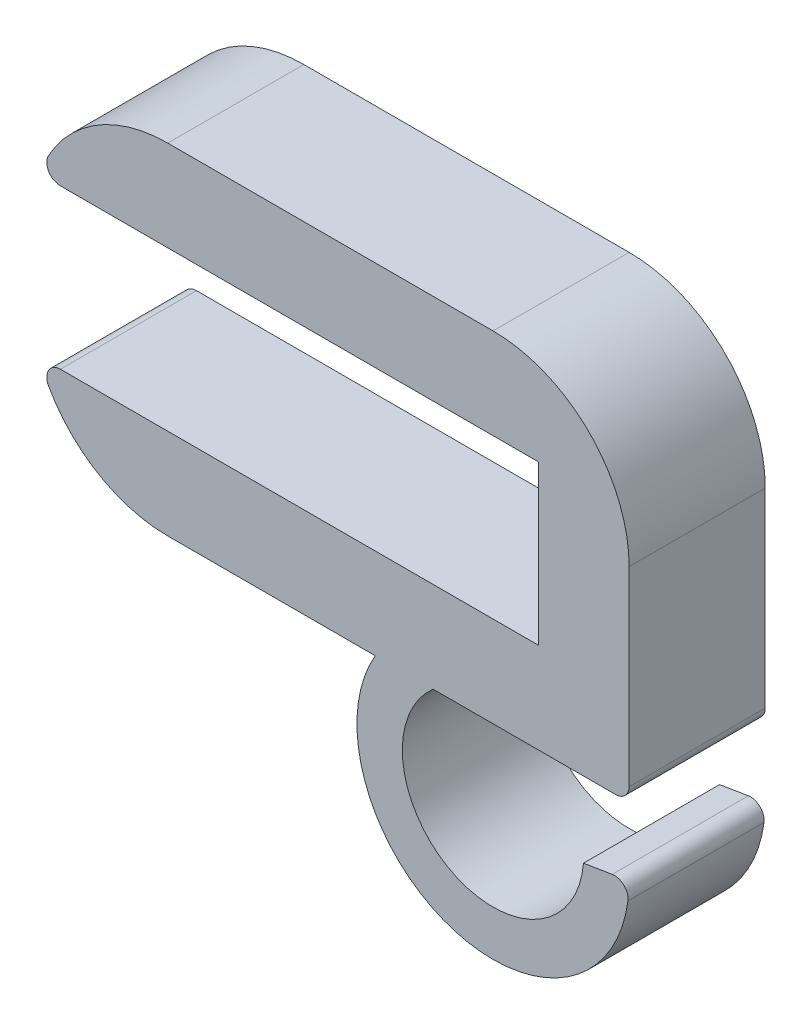
ISO-10303-21;
HEADER;
FILE_DESCRIPTION(('STEP AP214'),'2;1');
FILE_NAME('part.step','',(''),(''),'','','');
FILE_SCHEMA(('AUTOMOTIVE_DESIGN { 1 0 10303 214 1 1 1 1 }'));
ENDSEC;
DATA;
#1=APPLICATION_CONTEXT('core data for automotive mechanical design processes');
#2=APPLICATION_PROTOCOL_DEFINITION('international standard','automotive_design',2000,#1);
#3=PRODUCT_CONTEXT('',#1,'mechanical');
#4=PRODUCT('Part','Part','',(#3));
#5=PRODUCT_RELATED_PRODUCT_CATEGORY('part','',(#4));
#6=PRODUCT_DEFINITION_FORMATION('','',#4);
#7=PRODUCT_DEFINITION_CONTEXT('part definition',#1,'design');
#8=PRODUCT_DEFINITION('design','',#6,#7);
#9=PRODUCT_DEFINITION_SHAPE('','',#8);
#10=(LENGTH_UNIT() NAMED_UNIT(*) SI_UNIT(.MILLI.,.METRE.));
#11=(NAMED_UNIT(*) PLANE_ANGLE_UNIT() SI_UNIT($,.RADIAN.));
#12=(NAMED_UNIT(*) SI_UNIT($,.STERADIAN.) SOLID_ANGLE_UNIT());
#13=UNCERTAINTY_MEASURE_WITH_UNIT(LENGTH_MEASURE(1.E-05),#10,'distance_accuracy_value','');
#14=(GEOMETRIC_REPRESENTATION_CONTEXT(3) GLOBAL_UNCERTAINTY_ASSIGNED_CONTEXT((#13)) GLOBAL_UNIT_ASSIGNED_CONTEXT((#10,
#11,#12)) REPRESENTATION_CONTEXT('',''));
#15=CARTESIAN_POINT('',(0.,0.,0.));
#16=DIRECTION('',(0.,0.,1.));
#17=DIRECTION('',(1.,0.,0.));
#18=AXIS2_PLACEMENT_3D('',#15,#16,#17);
#19=CARTESIAN_POINT('',(0.,0.,3.));
#20=DIRECTION('',(0.,1.,0.));
#21=DIRECTION('',(0.,0.,1.));
#22=AXIS2_PLACEMENT_3D('',#19,#20,#21);
#23=PLANE('',#22);
#24=DIRECTION('',(1.,0.,0.));
#25=VECTOR('',#24,1.);
#26=CARTESIAN_POINT('',(0.,0.,0.));
#27=LINE('',#26,#25);
#28=CARTESIAN_POINT('',(2.82842712474619,0.,0.));
#29=VERTEX_POINT('',#28);
#30=CARTESIAN_POINT('',(7.40192378864668,0.,0.));
#31=VERTEX_POINT('',#30);
#32=EDGE_CURVE('E214',#29,#31,#27,.T.);
#33=ORIENTED_EDGE('',*,*,#32,.T.);
#34=DIRECTION('',(0.,0.,1.));
#35=VECTOR('',#34,1.);
#36=CARTESIAN_POINT('',(7.40192378864668,0.,0.));
#37=LINE('',#36,#35);
#38=CARTESIAN_POINT('',(7.40192378864668,0.,3.));
#39=VERTEX_POINT('',#38);
#40=EDGE_CURVE('E188',#31,#39,#37,.T.);
#41=ORIENTED_EDGE('',*,*,#40,.T.);
#42=DIRECTION('',(1.,0.,0.));
#43=VECTOR('',#42,1.);
#44=CARTESIAN_POINT('',(0.,0.,3.));
#45=LINE('',#44,#43);
#46=CARTESIAN_POINT('',(2.82842712474619,0.,3.));
#47=VERTEX_POINT('',#46);
#48=EDGE_CURVE('E217',#47,#39,#45,.T.);
#49=ORIENTED_EDGE('',*,*,#48,.F.);
#50=DIRECTION('',(0.,0.,1.));
#51=VECTOR('',#50,1.);
#52=CARTESIAN_POINT('',(2.82842712474619,0.,3.));
#53=LINE('',#52,#51);
#54=EDGE_CURVE('E164',#47,#29,#53,.F.);
#55=ORIENTED_EDGE('',*,*,#54,.T.);
#56=EDGE_LOOP('',(#33,#41,#49,#55));
#57=FACE_BOUND('',#56,.T.);
#58=ADVANCED_FACE('F33',(#57),#23,.F.);
#59=CARTESIAN_POINT('',(8.67712434446771,0.,0.));
#60=VERTEX_POINT('',#59);
#61=CARTESIAN_POINT('',(12.7,0.,0.));
#62=VERTEX_POINT('',#61);
#63=EDGE_CURVE('E225',#60,#62,#27,.T.);
#64=ORIENTED_EDGE('',*,*,#63,.T.);
#65=DIRECTION('',(0.,0.,-1.));
#66=VECTOR('',#65,1.);
#67=CARTESIAN_POINT('',(12.7,0.,3.));
#68=LINE('',#67,#66);
#69=CARTESIAN_POINT('',(12.7,0.,3.));
#70=VERTEX_POINT('',#69);
#71=EDGE_CURVE('E272',#62,#70,#68,.F.);
#72=ORIENTED_EDGE('',*,*,#71,.T.);
#73=CARTESIAN_POINT('',(8.67712434446771,0.,3.));
#74=VERTEX_POINT('',#73);
#75=EDGE_CURVE('E216',#74,#70,#45,.T.);
#76=ORIENTED_EDGE('',*,*,#75,.F.);
#77=DIRECTION('',(0.,0.,1.));
#78=VECTOR('',#77,1.);
#79=CARTESIAN_POINT('',(8.67712434446771,0.,0.));
#80=LINE('',#79,#78);
#81=EDGE_CURVE('E176',#60,#74,#80,.T.);
#82=ORIENTED_EDGE('',*,*,#81,.F.);
#83=EDGE_LOOP('',(#64,#72,#76,#82));
#84=FACE_BOUND('',#83,.T.);
#85=ADVANCED_FACE('F308',(#84),#23,.F.);
#86=CARTESIAN_POINT('',(13.,0.,3.));
#87=DIRECTION('',(-1.,0.,0.));
#88=DIRECTION('',(0.,0.,1.));
#89=AXIS2_PLACEMENT_3D('',#86,#87,#88);
#90=PLANE('',#89);
#91=DIRECTION('',(0.,1.,0.));
#92=VECTOR('',#91,1.);
#93=CARTESIAN_POINT('',(13.,0.,3.));
#94=LINE('',#93,#92);
#95=CARTESIAN_POINT('',(13.,0.3,3.));
#96=VERTEX_POINT('',#95);
#97=CARTESIAN_POINT('',(13.,4.5,3.));
#98=VERTEX_POINT('',#97);
#99=EDGE_CURVE('E213',#96,#98,#94,.T.);
#100=ORIENTED_EDGE('',*,*,#99,.F.);
#101=DIRECTION('',(0.,0.,-1.));
#102=VECTOR('',#101,1.);
#103=CARTESIAN_POINT('',(13.,0.3,3.));
#104=LINE('',#103,#102);
#105=CARTESIAN_POINT('',(13.,0.3,0.));
#106=VERTEX_POINT('',#105);
#107=EDGE_CURVE('E269',#96,#106,#104,.T.);
#108=ORIENTED_EDGE('',*,*,#107,.T.);
#109=DIRECTION('',(0.,1.,0.));
#110=VECTOR('',#109,1.);
#111=CARTESIAN_POINT('',(13.,0.,0.));
#112=LINE('',#111,#110);
#113=CARTESIAN_POINT('',(13.,4.5,0.));
#114=VERTEX_POINT('',#113);
#115=EDGE_CURVE('E223',#106,#114,#112,.T.);
#116=ORIENTED_EDGE('',*,*,#115,.T.);
#117=DIRECTION('',(0.,0.,-1.));
#118=VECTOR('',#117,1.);
#119=CARTESIAN_POINT('',(13.,4.5,3.));
#120=LINE('',#119,#118);
#121=EDGE_CURVE('E239',#114,#98,#120,.F.);
#122=ORIENTED_EDGE('',*,*,#121,.T.);
#123=EDGE_LOOP('',(#100,#108,#116,#122));
#124=FACE_BOUND('',#123,.T.);
#125=ADVANCED_FACE('F301',(#124),#90,.F.);
#126=CARTESIAN_POINT('',(0.,7.5,3.));
#127=DIRECTION('',(0.,1.,0.));
#128=DIRECTION('',(0.,0.,1.));
#129=AXIS2_PLACEMENT_3D('',#126,#127,#128);
#130=PLANE('',#129);
#131=DIRECTION('',(1.,0.,0.));
#132=VECTOR('',#131,1.);
#133=CARTESIAN_POINT('',(0.,7.5,3.));
#134=LINE('',#133,#132);
#135=CARTESIAN_POINT('',(2.82842712474619,7.5,3.));
#136=VERTEX_POINT('',#135);
#137=CARTESIAN_POINT('',(9.99999999999999,7.5,3.));
#138=VERTEX_POINT('',#137);
#139=EDGE_CURVE('E210',#136,#138,#134,.T.);
#140=ORIENTED_EDGE('',*,*,#139,.T.);
#141=DIRECTION('',(0.,0.,-1.));
#142=VECTOR('',#141,1.);
#143=CARTESIAN_POINT('',(10.,7.5,0.));
#144=LINE('',#143,#142);
#145=CARTESIAN_POINT('',(9.99999999999999,7.5,0.));
#146=VERTEX_POINT('',#145);
#147=EDGE_CURVE('E228',#138,#146,#144,.T.);
#148=ORIENTED_EDGE('',*,*,#147,.T.);
#149=DIRECTION('',(1.,0.,0.));
#150=VECTOR('',#149,1.);
#151=CARTESIAN_POINT('',(0.,7.5,0.));
#152=LINE('',#151,#150);
#153=CARTESIAN_POINT('',(2.82842712474619,7.5,0.));
#154=VERTEX_POINT('',#153);
#155=EDGE_CURVE('E207',#154,#146,#152,.T.);
#156=ORIENTED_EDGE('',*,*,#155,.F.);
#157=DIRECTION('',(0.,0.,1.));
#158=VECTOR('',#157,1.);
#159=CARTESIAN_POINT('',(2.82842712474619,7.5,3.));
#160=LINE('',#159,#158);
#161=EDGE_CURVE('E220',#154,#136,#160,.T.);
#162=ORIENTED_EDGE('',*,*,#161,.T.);
#163=EDGE_LOOP('',(#140,#148,#156,#162));
#164=FACE_BOUND('',#163,.T.);
#165=ADVANCED_FACE('F290',(#164),#130,.T.);
#166=CARTESIAN_POINT('',(0.,0.,3.));
#167=DIRECTION('',(0.,0.,-1.));
#168=DIRECTION('',(-1.,0.,0.));
#169=AXIS2_PLACEMENT_3D('',#166,#167,#168);
#170=PLANE('',#169);
#171=CARTESIAN_POINT('',(10.,-1.5,3.));
#172=DIRECTION('',(0.,0.,1.));
#173=DIRECTION('',(1.,0.,0.));
#174=AXIS2_PLACEMENT_3D('',#171,#172,#173);
#175=CIRCLE('',#174,3.);
#176=CARTESIAN_POINT('',(12.9736661077925,-1.89662309484698,3.));
#177=VERTEX_POINT('',#176);
#178=EDGE_CURVE('E179',#39,#177,#175,.T.);
#179=ORIENTED_EDGE('',*,*,#178,.T.);
#180=CARTESIAN_POINT('',(12.6762994970133,-1.85696078536228,3.));
#181=DIRECTION('',(0.,0.,-1.));
#182=DIRECTION('',(-1.,0.,0.));
#183=AXIS2_PLACEMENT_3D('',#180,#181,#182);
#184=CIRCLE('',#183,0.3);
#185=CARTESIAN_POINT('',(12.6278516739864,-1.56089861546555,3.));
#186=VERTEX_POINT('',#185);
#187=EDGE_CURVE('E172',#177,#186,#184,.F.);
#188=ORIENTED_EDGE('',*,*,#187,.T.);
#189=DIRECTION('',(0.986873899655769,0.161492743422779,0.));
#190=VECTOR('',#189,1.);
#191=CARTESIAN_POINT('',(10.,-1.99092212332024,3.));
#192=LINE('',#191,#190);
#193=CARTESIAN_POINT('',(11.99320255714,-1.66475304613407,3.));
#194=VERTEX_POINT('',#193);
#195=EDGE_CURVE('E155',#194,#186,#192,.T.);
#196=ORIENTED_EDGE('',*,*,#195,.F.);
#197=CARTESIAN_POINT('',(10.,-1.5,3.));
#198=DIRECTION('',(0.,0.,1.));
#199=DIRECTION('',(1.,0.,0.));
#200=AXIS2_PLACEMENT_3D('',#197,#198,#199);
#201=CIRCLE('',#200,2.);
#202=EDGE_CURVE('E171',#74,#194,#201,.T.);
#203=ORIENTED_EDGE('',*,*,#202,.F.);
#204=ORIENTED_EDGE('',*,*,#75,.T.);
#205=CARTESIAN_POINT('',(12.7,0.3,3.));
#206=DIRECTION('',(0.,0.,-1.));
#207=DIRECTION('',(-1.,0.,0.));
#208=AXIS2_PLACEMENT_3D('',#205,#206,#207);
#209=CIRCLE('',#208,0.3);
#210=EDGE_CURVE('E257',#70,#96,#209,.F.);
#211=ORIENTED_EDGE('',*,*,#210,.T.);
#212=ORIENTED_EDGE('',*,*,#99,.T.);
#213=CARTESIAN_POINT('',(10.,4.5,3.));
#214=DIRECTION('',(0.,0.,-1.));
#215=DIRECTION('',(-1.,0.,0.));
#216=AXIS2_PLACEMENT_3D('',#213,#214,#215);
#217=CIRCLE('',#216,3.);
#218=EDGE_CURVE('E247',#98,#138,#217,.F.);
#219=ORIENTED_EDGE('',*,*,#218,.T.);
#220=ORIENTED_EDGE('',*,*,#139,.F.);
#221=CARTESIAN_POINT('',(2.82842712474619,4.5,3.));
#222=DIRECTION('',(0.,0.,-1.));
#223=DIRECTION('',(-1.,0.,0.));
#224=AXIS2_PLACEMENT_3D('',#221,#222,#223);
#225=CIRCLE('',#224,3.);
#226=CARTESIAN_POINT('',(0.199058332257472,5.94444444444444,3.));
#227=VERTEX_POINT('',#226);
#228=EDGE_CURVE('E242',#136,#227,#225,.F.);
#229=ORIENTED_EDGE('',*,*,#228,.T.);
#230=CARTESIAN_POINT('',(0.461995211506343,5.8,3.));
#231=DIRECTION('',(0.,0.,-1.));
#232=DIRECTION('',(-1.,0.,0.));
#233=AXIS2_PLACEMENT_3D('',#230,#231,#232);
#234=CIRCLE('',#233,0.3);
#235=CARTESIAN_POINT('',(0.461995211506343,5.5,3.));
#236=VERTEX_POINT('',#235);
#237=EDGE_CURVE('E253',#227,#236,#234,.F.);
#238=ORIENTED_EDGE('',*,*,#237,.T.);
#239=DIRECTION('',(-1.,0.,0.));
#240=VECTOR('',#239,1.);
#241=CARTESIAN_POINT('',(0.,5.5,3.));
#242=LINE('',#241,#240);
#243=CARTESIAN_POINT('',(11.,5.5,3.));
#244=VERTEX_POINT('',#243);
#245=EDGE_CURVE('E194',#244,#236,#242,.T.);
#246=ORIENTED_EDGE('',*,*,#245,.F.);
#247=DIRECTION('',(0.,1.,0.));
#248=VECTOR('',#247,1.);
#249=CARTESIAN_POINT('',(11.,5.5,3.));
#250=LINE('',#249,#248);
#251=CARTESIAN_POINT('',(11.,2.,3.));
#252=VERTEX_POINT('',#251);
#253=EDGE_CURVE('E201',#252,#244,#250,.T.);
#254=ORIENTED_EDGE('',*,*,#253,.F.);
#255=DIRECTION('',(1.,0.,0.));
#256=VECTOR('',#255,1.);
#257=CARTESIAN_POINT('',(0.,2.,3.));
#258=LINE('',#257,#256);
#259=CARTESIAN_POINT('',(0.461995211506343,2.,3.));
#260=VERTEX_POINT('',#259);
#261=EDGE_CURVE('E190',#260,#252,#258,.T.);
#262=ORIENTED_EDGE('',*,*,#261,.F.);
#263=CARTESIAN_POINT('',(0.461995211506343,1.7,3.));
#264=DIRECTION('',(0.,0.,-1.));
#265=DIRECTION('',(-1.,0.,0.));
#266=AXIS2_PLACEMENT_3D('',#263,#264,#265);
#267=CIRCLE('',#266,0.3);
#268=CARTESIAN_POINT('',(0.199058332257472,1.55555555555556,3.));
#269=VERTEX_POINT('',#268);
#270=EDGE_CURVE('E255',#260,#269,#267,.F.);
#271=ORIENTED_EDGE('',*,*,#270,.T.);
#272=CARTESIAN_POINT('',(2.82842712474619,3.,3.));
#273=DIRECTION('',(0.,0.,-1.));
#274=DIRECTION('',(-1.,0.,0.));
#275=AXIS2_PLACEMENT_3D('',#272,#273,#274);
#276=CIRCLE('',#275,3.);
#277=EDGE_CURVE('E245',#269,#47,#276,.F.);
#278=ORIENTED_EDGE('',*,*,#277,.T.);
#279=ORIENTED_EDGE('',*,*,#48,.T.);
#280=EDGE_LOOP('',(#179,#188,#196,#203,#204,#211,#212,#219,#220,#229,#238,#246,#254,#262,#271,
#278,#279));
#281=FACE_BOUND('',#280,.T.);
#282=ADVANCED_FACE('F169',(#281),#170,.F.);
#283=CARTESIAN_POINT('',(0.,0.,0.));
#284=DIRECTION('',(0.,0.,-1.));
#285=DIRECTION('',(-1.,0.,0.));
#286=AXIS2_PLACEMENT_3D('',#283,#284,#285);
#287=PLANE('',#286);
#288=DIRECTION('',(0.986873899655769,0.161492743422779,0.));
#289=VECTOR('',#288,1.);
#290=CARTESIAN_POINT('',(10.,-1.99092212332024,0.));
#291=LINE('',#290,#289);
#292=CARTESIAN_POINT('',(11.99320255714,-1.66475304613407,0.));
#293=VERTEX_POINT('',#292);
#294=CARTESIAN_POINT('',(12.6278516739864,-1.56089861546555,0.));
#295=VERTEX_POINT('',#294);
#296=EDGE_CURVE('E158',#293,#295,#291,.T.);
#297=ORIENTED_EDGE('',*,*,#296,.T.);
#298=CARTESIAN_POINT('',(12.6762994970133,-1.85696078536228,0.));
#299=DIRECTION('',(0.,0.,-1.));
#300=DIRECTION('',(-1.,0.,0.));
#301=AXIS2_PLACEMENT_3D('',#298,#299,#300);
#302=CIRCLE('',#301,0.3);
#303=CARTESIAN_POINT('',(12.9736661077925,-1.89662309484698,0.));
#304=VERTEX_POINT('',#303);
#305=EDGE_CURVE('E267',#295,#304,#302,.T.);
#306=ORIENTED_EDGE('',*,*,#305,.T.);
#307=CARTESIAN_POINT('',(10.,-1.5,0.));
#308=DIRECTION('',(0.,0.,1.));
#309=DIRECTION('',(1.,0.,0.));
#310=AXIS2_PLACEMENT_3D('',#307,#308,#309);
#311=CIRCLE('',#310,3.);
#312=EDGE_CURVE('E183',#31,#304,#311,.T.);
#313=ORIENTED_EDGE('',*,*,#312,.F.);
#314=ORIENTED_EDGE('',*,*,#32,.F.);
#315=CARTESIAN_POINT('',(2.82842712474619,3.,0.));
#316=DIRECTION('',(0.,0.,-1.));
#317=DIRECTION('',(-1.,0.,0.));
#318=AXIS2_PLACEMENT_3D('',#315,#316,#317);
#319=CIRCLE('',#318,3.);
#320=CARTESIAN_POINT('',(0.199058332257472,1.55555555555556,0.));
#321=VERTEX_POINT('',#320);
#322=EDGE_CURVE('E233',#29,#321,#319,.T.);
#323=ORIENTED_EDGE('',*,*,#322,.T.);
#324=CARTESIAN_POINT('',(0.461995211506343,1.7,0.));
#325=DIRECTION('',(0.,0.,-1.));
#326=DIRECTION('',(-1.,0.,0.));
#327=AXIS2_PLACEMENT_3D('',#324,#325,#326);
#328=CIRCLE('',#327,0.3);
#329=CARTESIAN_POINT('',(0.461995211506343,2.,0.));
#330=VERTEX_POINT('',#329);
#331=EDGE_CURVE('E263',#321,#330,#328,.T.);
#332=ORIENTED_EDGE('',*,*,#331,.T.);
#333=DIRECTION('',(1.,0.,0.));
#334=VECTOR('',#333,1.);
#335=CARTESIAN_POINT('',(0.,2.,0.));
#336=LINE('',#335,#334);
#337=CARTESIAN_POINT('',(11.,2.,0.));
#338=VERTEX_POINT('',#337);
#339=EDGE_CURVE('E191',#330,#338,#336,.T.);
#340=ORIENTED_EDGE('',*,*,#339,.T.);
#341=DIRECTION('',(0.,1.,0.));
#342=VECTOR('',#341,1.);
#343=CARTESIAN_POINT('',(11.,5.5,0.));
#344=LINE('',#343,#342);
#345=CARTESIAN_POINT('',(11.,5.5,0.));
#346=VERTEX_POINT('',#345);
#347=EDGE_CURVE('E193',#338,#346,#344,.T.);
#348=ORIENTED_EDGE('',*,*,#347,.T.);
#349=DIRECTION('',(-1.,0.,0.));
#350=VECTOR('',#349,1.);
#351=CARTESIAN_POINT('',(0.,5.5,0.));
#352=LINE('',#351,#350);
#353=CARTESIAN_POINT('',(0.461995211506343,5.5,0.));
#354=VERTEX_POINT('',#353);
#355=EDGE_CURVE('E197',#346,#354,#352,.T.);
#356=ORIENTED_EDGE('',*,*,#355,.T.);
#357=CARTESIAN_POINT('',(0.461995211506343,5.8,0.));
#358=DIRECTION('',(0.,0.,-1.));
#359=DIRECTION('',(-1.,0.,0.));
#360=AXIS2_PLACEMENT_3D('',#357,#358,#359);
#361=CIRCLE('',#360,0.3);
#362=CARTESIAN_POINT('',(0.199058332257472,5.94444444444444,0.));
#363=VERTEX_POINT('',#362);
#364=EDGE_CURVE('E48',#354,#363,#361,.T.);
#365=ORIENTED_EDGE('',*,*,#364,.T.);
#366=CARTESIAN_POINT('',(2.82842712474619,4.5,0.));
#367=DIRECTION('',(0.,0.,-1.));
#368=DIRECTION('',(-1.,0.,0.));
#369=AXIS2_PLACEMENT_3D('',#366,#367,#368);
#370=CIRCLE('',#369,3.);
#371=EDGE_CURVE('E231',#363,#154,#370,.T.);
#372=ORIENTED_EDGE('',*,*,#371,.T.);
#373=ORIENTED_EDGE('',*,*,#155,.T.);
#374=CARTESIAN_POINT('',(10.,4.5,0.));
#375=DIRECTION('',(0.,0.,-1.));
#376=DIRECTION('',(-1.,0.,0.));
#377=AXIS2_PLACEMENT_3D('',#374,#375,#376);
#378=CIRCLE('',#377,3.);
#379=EDGE_CURVE('E236',#146,#114,#378,.T.);
#380=ORIENTED_EDGE('',*,*,#379,.T.);
#381=ORIENTED_EDGE('',*,*,#115,.F.);
#382=CARTESIAN_POINT('',(12.7,0.3,0.));
#383=DIRECTION('',(0.,0.,-1.));
#384=DIRECTION('',(-1.,0.,0.));
#385=AXIS2_PLACEMENT_3D('',#382,#383,#384);
#386=CIRCLE('',#385,0.3);
#387=EDGE_CURVE('E265',#106,#62,#386,.T.);
#388=ORIENTED_EDGE('',*,*,#387,.T.);
#389=ORIENTED_EDGE('',*,*,#63,.F.);
#390=CARTESIAN_POINT('',(10.,-1.5,0.));
#391=DIRECTION('',(0.,0.,1.));
#392=DIRECTION('',(1.,0.,0.));
#393=AXIS2_PLACEMENT_3D('',#390,#391,#392);
#394=CIRCLE('',#393,2.);
#395=EDGE_CURVE('E177',#60,#293,#394,.T.);
#396=ORIENTED_EDGE('',*,*,#395,.T.);
#397=EDGE_LOOP('',(#297,#306,#313,#314,#323,#332,#340,#348,#356,#365,#372,#373,#380,#381,#388,
#389,#396));
#398=FACE_BOUND('',#397,.T.);
#399=ADVANCED_FACE('F296',(#398),#287,.T.);
#400=CARTESIAN_POINT('',(0.,5.5,0.));
#401=DIRECTION('',(0.,1.,0.));
#402=DIRECTION('',(0.,0.,1.));
#403=AXIS2_PLACEMENT_3D('',#400,#401,#402);
#404=PLANE('',#403);
#405=ORIENTED_EDGE('',*,*,#245,.T.);
#406=DIRECTION('',(0.,0.,1.));
#407=VECTOR('',#406,1.);
#408=CARTESIAN_POINT('',(0.461995211506343,5.5,0.));
#409=LINE('',#408,#407);
#410=EDGE_CURVE('E11',#236,#354,#409,.F.);
#411=ORIENTED_EDGE('',*,*,#410,.T.);
#412=ORIENTED_EDGE('',*,*,#355,.F.);
#413=DIRECTION('',(0.,0.,1.));
#414=VECTOR('',#413,1.);
#415=CARTESIAN_POINT('',(11.,5.5,0.));
#416=LINE('',#415,#414);
#417=EDGE_CURVE('E205',#346,#244,#416,.T.);
#418=ORIENTED_EDGE('',*,*,#417,.T.);
#419=EDGE_LOOP('',(#405,#411,#412,#418));
#420=FACE_BOUND('',#419,.T.);
#421=ADVANCED_FACE('F425',(#420),#404,.F.);
#422=CARTESIAN_POINT('',(11.,5.5,0.));
#423=DIRECTION('',(1.,0.,0.));
#424=DIRECTION('',(0.,0.,-1.));
#425=AXIS2_PLACEMENT_3D('',#422,#423,#424);
#426=PLANE('',#425);
#427=ORIENTED_EDGE('',*,*,#253,.T.);
#428=ORIENTED_EDGE('',*,*,#417,.F.);
#429=ORIENTED_EDGE('',*,*,#347,.F.);
#430=DIRECTION('',(0.,0.,1.));
#431=VECTOR('',#430,1.);
#432=CARTESIAN_POINT('',(11.,2.,0.));
#433=LINE('',#432,#431);
#434=EDGE_CURVE('E199',#338,#252,#433,.T.);
#435=ORIENTED_EDGE('',*,*,#434,.T.);
#436=EDGE_LOOP('',(#427,#428,#429,#435));
#437=FACE_BOUND('',#436,.T.);
#438=ADVANCED_FACE('F337',(#437),#426,.F.);
#439=CARTESIAN_POINT('',(0.,2.,0.));
#440=DIRECTION('',(0.,-1.,0.));
#441=DIRECTION('',(0.,0.,-1.));
#442=AXIS2_PLACEMENT_3D('',#439,#440,#441);
#443=PLANE('',#442);
#444=ORIENTED_EDGE('',*,*,#339,.F.);
#445=DIRECTION('',(0.,0.,-1.));
#446=VECTOR('',#445,1.);
#447=CARTESIAN_POINT('',(0.461995211506343,2.,3.));
#448=LINE('',#447,#446);
#449=EDGE_CURVE('E274',#330,#260,#448,.F.);
#450=ORIENTED_EDGE('',*,*,#449,.T.);
#451=ORIENTED_EDGE('',*,*,#261,.T.);
#452=ORIENTED_EDGE('',*,*,#434,.F.);
#453=EDGE_LOOP('',(#444,#450,#451,#452));
#454=FACE_BOUND('',#453,.T.);
#455=ADVANCED_FACE('F333',(#454),#443,.F.);
#456=CARTESIAN_POINT('',(10.,4.5,3.));
#457=DIRECTION('',(0.,0.,1.));
#458=DIRECTION('',(1.,0.,0.));
#459=AXIS2_PLACEMENT_3D('',#456,#457,#458);
#460=CYLINDRICAL_SURFACE('',#459,3.);
#461=ORIENTED_EDGE('',*,*,#218,.F.);
#462=ORIENTED_EDGE('',*,*,#121,.F.);
#463=ORIENTED_EDGE('',*,*,#379,.F.);
#464=ORIENTED_EDGE('',*,*,#147,.F.);
#465=EDGE_LOOP('',(#461,#462,#463,#464));
#466=FACE_BOUND('',#465,.T.);
#467=ADVANCED_FACE('F293',(#466),#460,.T.);
#468=CARTESIAN_POINT('',(2.82842712474619,3.,3.));
#469=DIRECTION('',(0.,0.,1.));
#470=DIRECTION('',(1.,0.,0.));
#471=AXIS2_PLACEMENT_3D('',#468,#469,#470);
#472=CYLINDRICAL_SURFACE('',#471,3.);
#473=ORIENTED_EDGE('',*,*,#277,.F.);
#474=DIRECTION('',(0.,0.,1.));
#475=VECTOR('',#474,1.);
#476=CARTESIAN_POINT('',(0.199058332257471,1.55555555555556,3.));
#477=LINE('',#476,#475);
#478=EDGE_CURVE('E277',#269,#321,#477,.F.);
#479=ORIENTED_EDGE('',*,*,#478,.T.);
#480=ORIENTED_EDGE('',*,*,#322,.F.);
#481=ORIENTED_EDGE('',*,*,#54,.F.);
#482=EDGE_LOOP('',(#473,#479,#480,#481));
#483=FACE_BOUND('',#482,.T.);
#484=ADVANCED_FACE('F324',(#483),#472,.T.);
#485=CARTESIAN_POINT('',(2.82842712474619,4.5,3.));
#486=DIRECTION('',(0.,0.,-1.));
#487=DIRECTION('',(-1.,0.,0.));
#488=AXIS2_PLACEMENT_3D('',#485,#486,#487);
#489=CYLINDRICAL_SURFACE('',#488,3.);
#490=ORIENTED_EDGE('',*,*,#371,.F.);
#491=DIRECTION('',(0.,0.,-1.));
#492=VECTOR('',#491,1.);
#493=CARTESIAN_POINT('',(0.199058332257471,5.94444444444444,3.));
#494=LINE('',#493,#492);
#495=EDGE_CURVE('E41',#363,#227,#494,.F.);
#496=ORIENTED_EDGE('',*,*,#495,.T.);
#497=ORIENTED_EDGE('',*,*,#228,.F.);
#498=ORIENTED_EDGE('',*,*,#161,.F.);
#499=EDGE_LOOP('',(#490,#496,#497,#498));
#500=FACE_BOUND('',#499,.T.);
#501=ADVANCED_FACE('F282',(#500),#489,.T.);
#502=CARTESIAN_POINT('',(10.,-1.5,0.));
#503=DIRECTION('',(0.,0.,1.));
#504=DIRECTION('',(1.,0.,0.));
#505=AXIS2_PLACEMENT_3D('',#502,#503,#504);
#506=CYLINDRICAL_SURFACE('',#505,3.);
#507=ORIENTED_EDGE('',*,*,#312,.T.);
#508=DIRECTION('',(0.,0.,1.));
#509=VECTOR('',#508,1.);
#510=CARTESIAN_POINT('',(12.9736661077925,-1.89662309484698,0.));
#511=LINE('',#510,#509);
#512=EDGE_CURVE('E163',#304,#177,#511,.T.);
#513=ORIENTED_EDGE('',*,*,#512,.T.);
#514=ORIENTED_EDGE('',*,*,#178,.F.);
#515=ORIENTED_EDGE('',*,*,#40,.F.);
#516=EDGE_LOOP('',(#507,#513,#514,#515));
#517=FACE_BOUND('',#516,.T.);
#518=ADVANCED_FACE('F316',(#517),#506,.T.);
#519=CARTESIAN_POINT('',(10.,-1.5,0.));
#520=DIRECTION('',(0.,0.,1.));
#521=DIRECTION('',(1.,0.,0.));
#522=AXIS2_PLACEMENT_3D('',#519,#520,#521);
#523=CYLINDRICAL_SURFACE('',#522,2.);
#524=ORIENTED_EDGE('',*,*,#202,.T.);
#525=DIRECTION('',(0.,0.,1.));
#526=VECTOR('',#525,1.);
#527=CARTESIAN_POINT('',(11.99320255714,-1.66475304613407,0.));
#528=LINE('',#527,#526);
#529=EDGE_CURVE('E152',#194,#293,#528,.F.);
#530=ORIENTED_EDGE('',*,*,#529,.T.);
#531=ORIENTED_EDGE('',*,*,#395,.F.);
#532=ORIENTED_EDGE('',*,*,#81,.T.);
#533=EDGE_LOOP('',(#524,#530,#531,#532));
#534=FACE_BOUND('',#533,.T.);
#535=ADVANCED_FACE('F175',(#534),#523,.F.);
#536=CARTESIAN_POINT('',(10.,-1.99092212332024,0.));
#537=DIRECTION('',(0.161492743422779,-0.986873899655769,0.));
#538=DIRECTION('',(0.986873899655769,0.161492743422779,0.));
#539=AXIS2_PLACEMENT_3D('',#536,#537,#538);
#540=PLANE('',#539);
#541=ORIENTED_EDGE('',*,*,#195,.T.);
#542=DIRECTION('',(0.,0.,-1.));
#543=VECTOR('',#542,1.);
#544=CARTESIAN_POINT('',(12.6278516739864,-1.56089861546555,0.));
#545=LINE('',#544,#543);
#546=EDGE_CURVE('E260',#186,#295,#545,.T.);
#547=ORIENTED_EDGE('',*,*,#546,.T.);
#548=ORIENTED_EDGE('',*,*,#296,.F.);
#549=ORIENTED_EDGE('',*,*,#529,.F.);
#550=EDGE_LOOP('',(#541,#547,#548,#549));
#551=FACE_BOUND('',#550,.T.);
#552=ADVANCED_FACE('F154',(#551),#540,.F.);
#553=CARTESIAN_POINT('',(12.6762994970133,-1.85696078536228,0.));
#554=DIRECTION('',(0.,0.,1.));
#555=DIRECTION('',(1.,0.,0.));
#556=AXIS2_PLACEMENT_3D('',#553,#554,#555);
#557=CYLINDRICAL_SURFACE('',#556,0.3);
#558=ORIENTED_EDGE('',*,*,#305,.F.);
#559=ORIENTED_EDGE('',*,*,#546,.F.);
#560=ORIENTED_EDGE('',*,*,#187,.F.);
#561=ORIENTED_EDGE('',*,*,#512,.F.);
#562=EDGE_LOOP('',(#558,#559,#560,#561));
#563=FACE_BOUND('',#562,.T.);
#564=ADVANCED_FACE('F313',(#563),#557,.T.);
#565=CARTESIAN_POINT('',(12.7,0.3,3.));
#566=DIRECTION('',(0.,0.,-1.));
#567=DIRECTION('',(-1.,0.,0.));
#568=AXIS2_PLACEMENT_3D('',#565,#566,#567);
#569=CYLINDRICAL_SURFACE('',#568,0.3);
#570=ORIENTED_EDGE('',*,*,#210,.F.);
#571=ORIENTED_EDGE('',*,*,#71,.F.);
#572=ORIENTED_EDGE('',*,*,#387,.F.);
#573=ORIENTED_EDGE('',*,*,#107,.F.);
#574=EDGE_LOOP('',(#570,#571,#572,#573));
#575=FACE_BOUND('',#574,.T.);
#576=ADVANCED_FACE('F305',(#575),#569,.T.);
#577=CARTESIAN_POINT('',(0.461995211506343,1.7,3.));
#578=DIRECTION('',(0.,0.,1.));
#579=DIRECTION('',(1.,0.,0.));
#580=AXIS2_PLACEMENT_3D('',#577,#578,#579);
#581=CYLINDRICAL_SURFACE('',#580,0.3);
#582=ORIENTED_EDGE('',*,*,#331,.F.);
#583=ORIENTED_EDGE('',*,*,#478,.F.);
#584=ORIENTED_EDGE('',*,*,#270,.F.);
#585=ORIENTED_EDGE('',*,*,#449,.F.);
#586=EDGE_LOOP('',(#582,#583,#584,#585));
#587=FACE_BOUND('',#586,.T.);
#588=ADVANCED_FACE('F330',(#587),#581,.T.);
#589=CARTESIAN_POINT('',(0.461995211506343,5.8,3.));
#590=DIRECTION('',(0.,0.,-1.));
#591=DIRECTION('',(-1.,0.,0.));
#592=AXIS2_PLACEMENT_3D('',#589,#590,#591);
#593=CYLINDRICAL_SURFACE('',#592,0.3);
#594=ORIENTED_EDGE('',*,*,#364,.F.);
#595=ORIENTED_EDGE('',*,*,#410,.F.);
#596=ORIENTED_EDGE('',*,*,#237,.F.);
#597=ORIENTED_EDGE('',*,*,#495,.F.);
#598=EDGE_LOOP('',(#594,#595,#596,#597));
#599=FACE_BOUND('',#598,.T.);
#600=ADVANCED_FACE('F35',(#599),#593,.T.);
#601=CLOSED_SHELL('',(#58,#85,#125,#165,#282,#399,#421,#438,#455,#467,#484,#501,#518,#535,#552,
#564,#576,#588,#600));
#602=MANIFOLD_SOLID_BREP('B2',#601);
#603=ADVANCED_BREP_SHAPE_REPRESENTATION('',(#18,#602),#14);
#604=SHAPE_DEFINITION_REPRESENTATION(#9,#603);
ENDSEC;
END-ISO-10303-21;
